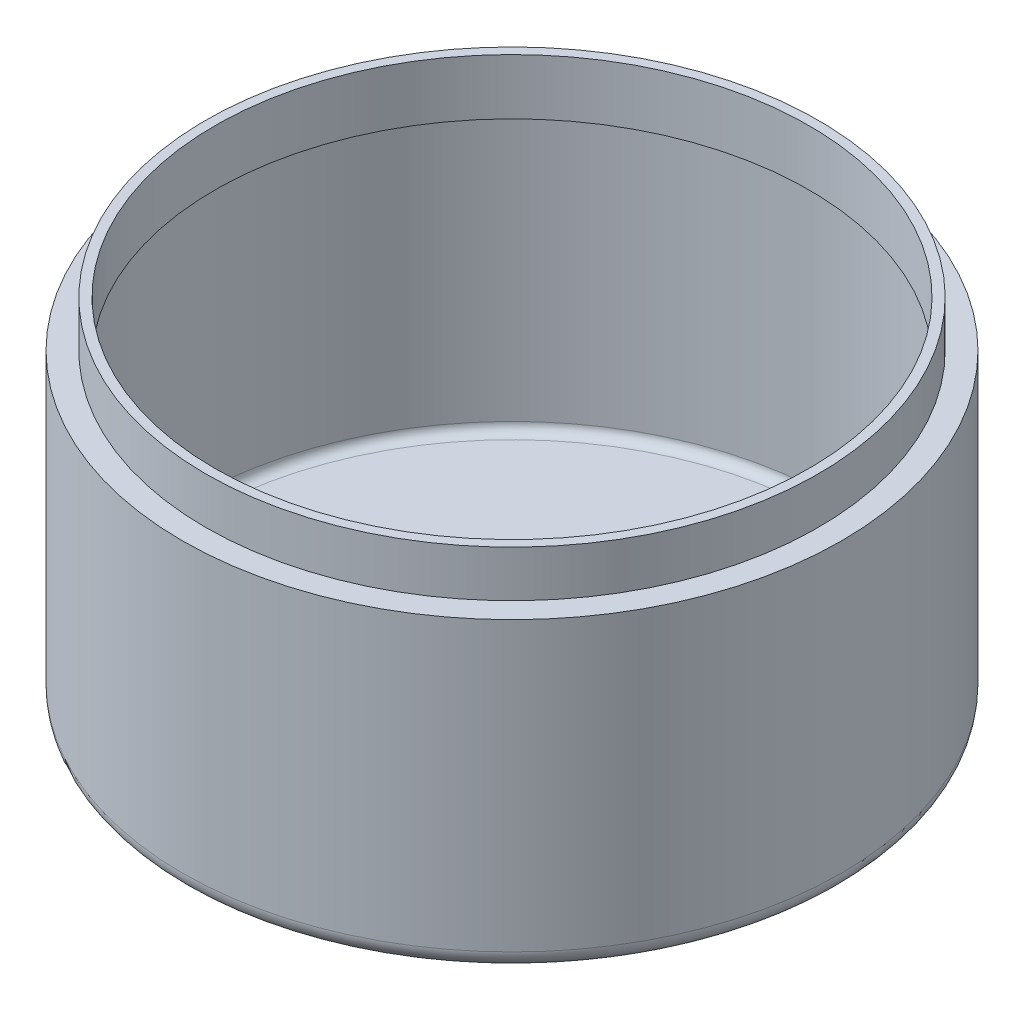
ISO-10303-21;
HEADER;
FILE_DESCRIPTION(('STEP AP214'),'2;1');
FILE_NAME('part.step','',(''),(''),'','','');
FILE_SCHEMA(('AUTOMOTIVE_DESIGN { 1 0 10303 214 1 1 1 1 }'));
ENDSEC;
DATA;
#1=APPLICATION_CONTEXT('core data for automotive mechanical design processes');
#2=APPLICATION_PROTOCOL_DEFINITION('international standard','automotive_design',2000,#1);
#3=PRODUCT_CONTEXT('',#1,'mechanical');
#4=PRODUCT('Part','Part','',(#3));
#5=PRODUCT_RELATED_PRODUCT_CATEGORY('part','',(#4));
#6=PRODUCT_DEFINITION_FORMATION('','',#4);
#7=PRODUCT_DEFINITION_CONTEXT('part definition',#1,'design');
#8=PRODUCT_DEFINITION('design','',#6,#7);
#9=PRODUCT_DEFINITION_SHAPE('','',#8);
#10=(LENGTH_UNIT() NAMED_UNIT(*) SI_UNIT(.MILLI.,.METRE.));
#11=(NAMED_UNIT(*) PLANE_ANGLE_UNIT() SI_UNIT($,.RADIAN.));
#12=(NAMED_UNIT(*) SI_UNIT($,.STERADIAN.) SOLID_ANGLE_UNIT());
#13=UNCERTAINTY_MEASURE_WITH_UNIT(LENGTH_MEASURE(1.E-05),#10,'distance_accuracy_value','');
#14=(GEOMETRIC_REPRESENTATION_CONTEXT(3) GLOBAL_UNCERTAINTY_ASSIGNED_CONTEXT((#13)) GLOBAL_UNIT_ASSIGNED_CONTEXT((#10,
#11,#12)) REPRESENTATION_CONTEXT('',''));
#15=CARTESIAN_POINT('',(0.,0.,0.));
#16=DIRECTION('',(0.,0.,1.));
#17=DIRECTION('',(1.,0.,0.));
#18=AXIS2_PLACEMENT_3D('',#15,#16,#17);
#19=CARTESIAN_POINT('',(0.,-36.,0.));
#20=DIRECTION('',(0.,1.,0.));
#21=DIRECTION('',(0.,0.,1.));
#22=AXIS2_PLACEMENT_3D('',#19,#20,#21);
#23=TOROIDAL_SURFACE('',#22,33.5,2.);
#24=CARTESIAN_POINT('',(0.,-38.,0.));
#25=DIRECTION('',(0.,1.,0.));
#26=DIRECTION('',(0.,0.,1.));
#27=AXIS2_PLACEMENT_3D('',#24,#25,#26);
#28=CIRCLE('',#27,33.5);
#29=CARTESIAN_POINT('',(0.,-38.,33.5));
#30=VERTEX_POINT('',#29);
#31=EDGE_CURVE('E10',#30,#30,#28,.T.);
#32=ORIENTED_EDGE('',*,*,#31,.T.);
#33=EDGE_LOOP('',(#32));
#34=FACE_BOUND('',#33,.T.);
#35=CARTESIAN_POINT('',(0.,-36.,0.));
#36=DIRECTION('',(0.,1.,0.));
#37=DIRECTION('',(0.,0.,1.));
#38=AXIS2_PLACEMENT_3D('',#35,#36,#37);
#39=CIRCLE('',#38,35.5);
#40=CARTESIAN_POINT('',(0.,-36.,35.5));
#41=VERTEX_POINT('',#40);
#42=EDGE_CURVE('E71',#41,#41,#39,.T.);
#43=ORIENTED_EDGE('',*,*,#42,.F.);
#44=EDGE_LOOP('',(#43));
#45=FACE_BOUND('',#44,.T.);
#46=ADVANCED_FACE('F37',(#34,#45),#23,.T.);
#47=CARTESIAN_POINT('',(0.,-38.,-33.5));
#48=DIRECTION('',(0.,-1.,0.));
#49=DIRECTION('',(0.,0.,-1.));
#50=AXIS2_PLACEMENT_3D('',#47,#48,#49);
#51=PLANE('',#50);
#52=ORIENTED_EDGE('',*,*,#31,.F.);
#53=EDGE_LOOP('',(#52));
#54=FACE_BOUND('',#53,.T.);
#55=ADVANCED_FACE('F79',(#54),#51,.T.);
#56=CARTESIAN_POINT('',(0.,-37.,-33.5));
#57=DIRECTION('',(0.,-1.,0.));
#58=DIRECTION('',(0.,0.,-1.));
#59=AXIS2_PLACEMENT_3D('',#56,#57,#58);
#60=PLANE('',#59);
#61=CARTESIAN_POINT('',(0.,-37.,0.));
#62=DIRECTION('',(0.,1.,0.));
#63=DIRECTION('',(0.,0.,1.));
#64=AXIS2_PLACEMENT_3D('',#61,#62,#63);
#65=CIRCLE('',#64,33.5);
#66=CARTESIAN_POINT('',(0.,-37.,33.5));
#67=VERTEX_POINT('',#66);
#68=EDGE_CURVE('E43',#67,#67,#65,.T.);
#69=ORIENTED_EDGE('',*,*,#68,.T.);
#70=EDGE_LOOP('',(#69));
#71=FACE_BOUND('',#70,.T.);
#72=ADVANCED_FACE('F83',(#71),#60,.F.);
#73=CARTESIAN_POINT('',(0.,-36.,0.));
#74=DIRECTION('',(0.,1.,0.));
#75=DIRECTION('',(0.,0.,1.));
#76=AXIS2_PLACEMENT_3D('',#73,#74,#75);
#77=TOROIDAL_SURFACE('',#76,33.5,1.);
#78=ORIENTED_EDGE('',*,*,#68,.F.);
#79=EDGE_LOOP('',(#78));
#80=FACE_BOUND('',#79,.T.);
#81=CARTESIAN_POINT('',(0.,-36.,0.));
#82=DIRECTION('',(0.,1.,0.));
#83=DIRECTION('',(0.,0.,1.));
#84=AXIS2_PLACEMENT_3D('',#81,#82,#83);
#85=CIRCLE('',#84,34.5);
#86=CARTESIAN_POINT('',(0.,-36.,34.5));
#87=VERTEX_POINT('',#86);
#88=EDGE_CURVE('E47',#87,#87,#85,.T.);
#89=ORIENTED_EDGE('',*,*,#88,.T.);
#90=EDGE_LOOP('',(#89));
#91=FACE_BOUND('',#90,.T.);
#92=ADVANCED_FACE('F88',(#80,#91),#77,.F.);
#93=CARTESIAN_POINT('',(0.,1.9,0.));
#94=DIRECTION('',(0.,1.,0.));
#95=DIRECTION('',(0.,0.,1.));
#96=AXIS2_PLACEMENT_3D('',#93,#94,#95);
#97=CYLINDRICAL_SURFACE('',#96,34.5);
#98=ORIENTED_EDGE('',*,*,#88,.F.);
#99=EDGE_LOOP('',(#98));
#100=FACE_BOUND('',#99,.T.);
#101=CARTESIAN_POINT('',(0.,-6.,0.));
#102=DIRECTION('',(0.,1.,0.));
#103=DIRECTION('',(0.,0.,1.));
#104=AXIS2_PLACEMENT_3D('',#101,#102,#103);
#105=CIRCLE('',#104,34.5);
#106=CARTESIAN_POINT('',(0.,-6.,34.5));
#107=VERTEX_POINT('',#106);
#108=EDGE_CURVE('E51',#107,#107,#105,.T.);
#109=ORIENTED_EDGE('',*,*,#108,.T.);
#110=EDGE_LOOP('',(#109));
#111=FACE_BOUND('',#110,.T.);
#112=ADVANCED_FACE('F93',(#100,#111),#97,.F.);
#113=CARTESIAN_POINT('',(0.,-6.,-32.));
#114=DIRECTION('',(0.,1.,0.));
#115=DIRECTION('',(0.,0.,1.));
#116=AXIS2_PLACEMENT_3D('',#113,#114,#115);
#117=PLANE('',#116);
#118=ORIENTED_EDGE('',*,*,#108,.F.);
#119=EDGE_LOOP('',(#118));
#120=FACE_BOUND('',#119,.T.);
#121=CARTESIAN_POINT('',(0.,-6.,0.));
#122=DIRECTION('',(0.,1.,0.));
#123=DIRECTION('',(0.,0.,1.));
#124=AXIS2_PLACEMENT_3D('',#121,#122,#123);
#125=CIRCLE('',#124,32.);
#126=CARTESIAN_POINT('',(0.,-6.,32.));
#127=VERTEX_POINT('',#126);
#128=EDGE_CURVE('E56',#127,#127,#125,.T.);
#129=ORIENTED_EDGE('',*,*,#128,.T.);
#130=EDGE_LOOP('',(#129));
#131=FACE_BOUND('',#130,.T.);
#132=ADVANCED_FACE('F97',(#120,#131),#117,.F.);
#133=CARTESIAN_POINT('',(0.,1.9,0.));
#134=DIRECTION('',(0.,1.,0.));
#135=DIRECTION('',(0.,0.,1.));
#136=AXIS2_PLACEMENT_3D('',#133,#134,#135);
#137=CYLINDRICAL_SURFACE('',#136,32.);
#138=ORIENTED_EDGE('',*,*,#128,.F.);
#139=EDGE_LOOP('',(#138));
#140=FACE_BOUND('',#139,.T.);
#141=CARTESIAN_POINT('',(0.,0.,0.));
#142=DIRECTION('',(0.,1.,0.));
#143=DIRECTION('',(0.,0.,1.));
#144=AXIS2_PLACEMENT_3D('',#141,#142,#143);
#145=CIRCLE('',#144,32.);
#146=CARTESIAN_POINT('',(0.,0.,32.));
#147=VERTEX_POINT('',#146);
#148=EDGE_CURVE('E59',#147,#147,#145,.T.);
#149=ORIENTED_EDGE('',*,*,#148,.T.);
#150=EDGE_LOOP('',(#149));
#151=FACE_BOUND('',#150,.T.);
#152=ADVANCED_FACE('F101',(#140,#151),#137,.F.);
#153=CARTESIAN_POINT('',(0.,0.,-33.));
#154=DIRECTION('',(0.,-1.,0.));
#155=DIRECTION('',(0.,0.,-1.));
#156=AXIS2_PLACEMENT_3D('',#153,#154,#155);
#157=PLANE('',#156);
#158=ORIENTED_EDGE('',*,*,#148,.F.);
#159=EDGE_LOOP('',(#158));
#160=FACE_BOUND('',#159,.T.);
#161=CARTESIAN_POINT('',(0.,0.,0.));
#162=DIRECTION('',(0.,1.,0.));
#163=DIRECTION('',(0.,0.,1.));
#164=AXIS2_PLACEMENT_3D('',#161,#162,#163);
#165=CIRCLE('',#164,33.);
#166=CARTESIAN_POINT('',(0.,0.,33.));
#167=VERTEX_POINT('',#166);
#168=EDGE_CURVE('E62',#167,#167,#165,.T.);
#169=ORIENTED_EDGE('',*,*,#168,.T.);
#170=EDGE_LOOP('',(#169));
#171=FACE_BOUND('',#170,.T.);
#172=ADVANCED_FACE('F105',(#160,#171),#157,.F.);
#173=CARTESIAN_POINT('',(0.,1.9,0.));
#174=DIRECTION('',(0.,1.,0.));
#175=DIRECTION('',(0.,0.,1.));
#176=AXIS2_PLACEMENT_3D('',#173,#174,#175);
#177=CYLINDRICAL_SURFACE('',#176,33.);
#178=CARTESIAN_POINT('',(0.,-5.,0.));
#179=DIRECTION('',(0.,1.,0.));
#180=DIRECTION('',(0.,0.,1.));
#181=AXIS2_PLACEMENT_3D('',#178,#179,#180);
#182=CIRCLE('',#181,33.);
#183=CARTESIAN_POINT('',(0.,-5.,33.));
#184=VERTEX_POINT('',#183);
#185=EDGE_CURVE('E65',#184,#184,#182,.T.);
#186=ORIENTED_EDGE('',*,*,#185,.T.);
#187=EDGE_LOOP('',(#186));
#188=FACE_BOUND('',#187,.T.);
#189=ORIENTED_EDGE('',*,*,#168,.F.);
#190=EDGE_LOOP('',(#189));
#191=FACE_BOUND('',#190,.T.);
#192=ADVANCED_FACE('F109',(#188,#191),#177,.T.);
#193=CARTESIAN_POINT('',(0.,-5.,-33.));
#194=DIRECTION('',(0.,1.,0.));
#195=DIRECTION('',(0.,0.,1.));
#196=AXIS2_PLACEMENT_3D('',#193,#194,#195);
#197=PLANE('',#196);
#198=CARTESIAN_POINT('',(0.,-5.,0.));
#199=DIRECTION('',(0.,1.,0.));
#200=DIRECTION('',(0.,0.,1.));
#201=AXIS2_PLACEMENT_3D('',#198,#199,#200);
#202=CIRCLE('',#201,35.5);
#203=CARTESIAN_POINT('',(0.,-5.,35.5));
#204=VERTEX_POINT('',#203);
#205=EDGE_CURVE('E68',#204,#204,#202,.T.);
#206=ORIENTED_EDGE('',*,*,#205,.T.);
#207=EDGE_LOOP('',(#206));
#208=FACE_BOUND('',#207,.T.);
#209=ORIENTED_EDGE('',*,*,#185,.F.);
#210=EDGE_LOOP('',(#209));
#211=FACE_BOUND('',#210,.T.);
#212=ADVANCED_FACE('F113',(#208,#211),#197,.T.);
#213=CARTESIAN_POINT('',(0.,1.9,0.));
#214=DIRECTION('',(0.,1.,0.));
#215=DIRECTION('',(0.,0.,1.));
#216=AXIS2_PLACEMENT_3D('',#213,#214,#215);
#217=CYLINDRICAL_SURFACE('',#216,35.5);
#218=ORIENTED_EDGE('',*,*,#42,.T.);
#219=EDGE_LOOP('',(#218));
#220=FACE_BOUND('',#219,.T.);
#221=ORIENTED_EDGE('',*,*,#205,.F.);
#222=EDGE_LOOP('',(#221));
#223=FACE_BOUND('',#222,.T.);
#224=ADVANCED_FACE('F75',(#220,#223),#217,.T.);
#225=CLOSED_SHELL('',(#46,#55,#72,#92,#112,#132,#152,#172,#192,#212,#224));
#226=MANIFOLD_SOLID_BREP('B2',#225);
#227=ADVANCED_BREP_SHAPE_REPRESENTATION('',(#18,#226),#14);
#228=SHAPE_DEFINITION_REPRESENTATION(#9,#227);
ENDSEC;
END-ISO-10303-21;
